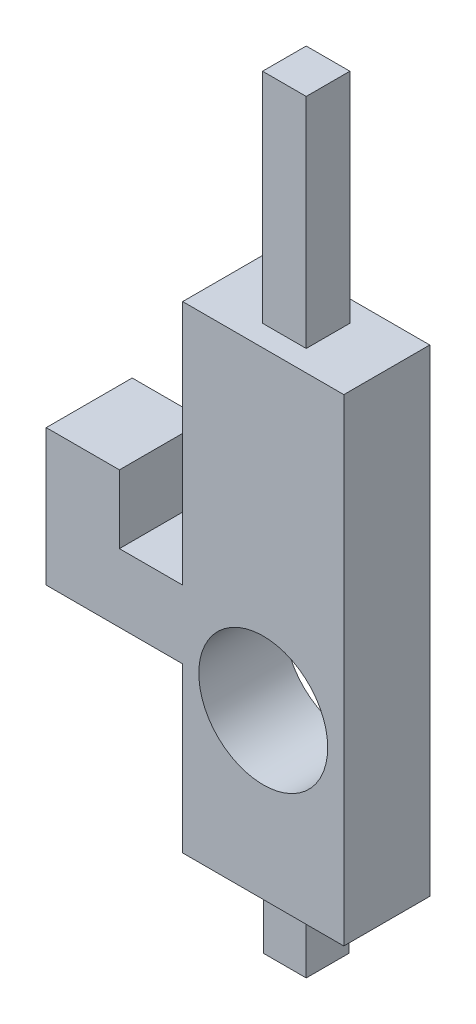
ISO-10303-21;
HEADER;
FILE_DESCRIPTION(('STEP AP214'),'2;1');
FILE_NAME('part.step','',(''),(''),'','','');
FILE_SCHEMA(('AUTOMOTIVE_DESIGN { 1 0 10303 214 1 1 1 1 }'));
ENDSEC;
DATA;
#1=APPLICATION_CONTEXT('core data for automotive mechanical design processes');
#2=APPLICATION_PROTOCOL_DEFINITION('international standard','automotive_design',2000,#1);
#3=PRODUCT_CONTEXT('',#1,'mechanical');
#4=PRODUCT('Part','Part','',(#3));
#5=PRODUCT_RELATED_PRODUCT_CATEGORY('part','',(#4));
#6=PRODUCT_DEFINITION_FORMATION('','',#4);
#7=PRODUCT_DEFINITION_CONTEXT('part definition',#1,'design');
#8=PRODUCT_DEFINITION('design','',#6,#7);
#9=PRODUCT_DEFINITION_SHAPE('','',#8);
#10=(LENGTH_UNIT() NAMED_UNIT(*) SI_UNIT(.MILLI.,.METRE.));
#11=(NAMED_UNIT(*) PLANE_ANGLE_UNIT() SI_UNIT($,.RADIAN.));
#12=(NAMED_UNIT(*) SI_UNIT($,.STERADIAN.) SOLID_ANGLE_UNIT());
#13=UNCERTAINTY_MEASURE_WITH_UNIT(LENGTH_MEASURE(1.E-05),#10,'distance_accuracy_value','');
#14=(GEOMETRIC_REPRESENTATION_CONTEXT(3) GLOBAL_UNCERTAINTY_ASSIGNED_CONTEXT((#13)) GLOBAL_UNIT_ASSIGNED_CONTEXT((#10,
#11,#12)) REPRESENTATION_CONTEXT('',''));
#15=CARTESIAN_POINT('',(0.,0.,0.));
#16=DIRECTION('',(0.,0.,1.));
#17=DIRECTION('',(1.,0.,0.));
#18=AXIS2_PLACEMENT_3D('',#15,#16,#17);
#19=CARTESIAN_POINT('',(-20.2,27.94,-3.99999999999999));
#20=DIRECTION('',(0.,-1.,0.));
#21=DIRECTION('',(0.,0.,-1.));
#22=AXIS2_PLACEMENT_3D('',#19,#20,#21);
#23=PLANE('',#22);
#24=DIRECTION('',(0.,0.,-1.));
#25=VECTOR('',#24,1.);
#26=CARTESIAN_POINT('',(-13.3876706043336,27.94,3.99999999999999));
#27=LINE('',#26,#25);
#28=CARTESIAN_POINT('',(-13.3876706043336,27.94,3.99999999999999));
#29=VERTEX_POINT('',#28);
#30=CARTESIAN_POINT('',(-13.3876706043336,27.94,-3.99999999999999));
#31=VERTEX_POINT('',#30);
#32=EDGE_CURVE('E181',#29,#31,#27,.T.);
#33=ORIENTED_EDGE('',*,*,#32,.F.);
#34=DIRECTION('',(1.,0.,0.));
#35=VECTOR('',#34,1.);
#36=CARTESIAN_POINT('',(-20.2,27.94,4.));
#37=LINE('',#36,#35);
#38=CARTESIAN_POINT('',(-7.5,27.94,4.));
#39=VERTEX_POINT('',#38);
#40=EDGE_CURVE('E204',#29,#39,#37,.T.);
#41=ORIENTED_EDGE('',*,*,#40,.T.);
#42=DIRECTION('',(0.,0.,-1.));
#43=VECTOR('',#42,1.);
#44=CARTESIAN_POINT('',(-7.5,27.94,-4.));
#45=LINE('',#44,#43);
#46=CARTESIAN_POINT('',(-7.5,27.94,-4.));
#47=VERTEX_POINT('',#46);
#48=EDGE_CURVE('E190',#39,#47,#45,.T.);
#49=ORIENTED_EDGE('',*,*,#48,.T.);
#50=DIRECTION('',(1.,0.,0.));
#51=VECTOR('',#50,1.);
#52=CARTESIAN_POINT('',(-20.2,27.94,-3.99999999999999));
#53=LINE('',#52,#51);
#54=EDGE_CURVE('E202',#31,#47,#53,.T.);
#55=ORIENTED_EDGE('',*,*,#54,.F.);
#56=EDGE_LOOP('',(#33,#41,#49,#55));
#57=FACE_BOUND('',#56,.T.);
#58=ADVANCED_FACE('F33',(#57),#23,.F.);
#59=CARTESIAN_POINT('',(-7.5,50.8,-4.));
#60=DIRECTION('',(1.,0.,0.));
#61=DIRECTION('',(0.,0.,-1.));
#62=AXIS2_PLACEMENT_3D('',#59,#60,#61);
#63=PLANE('',#62);
#64=DIRECTION('',(0.,0.,1.));
#65=VECTOR('',#64,1.);
#66=CARTESIAN_POINT('',(-7.5,21.59,-4.));
#67=LINE('',#66,#65);
#68=CARTESIAN_POINT('',(-7.5,21.59,-4.));
#69=VERTEX_POINT('',#68);
#70=CARTESIAN_POINT('',(-7.5,21.59,4.));
#71=VERTEX_POINT('',#70);
#72=EDGE_CURVE('E48',#69,#71,#67,.T.);
#73=ORIENTED_EDGE('',*,*,#72,.F.);
#74=DIRECTION('',(0.,-1.,0.));
#75=VECTOR('',#74,1.);
#76=CARTESIAN_POINT('',(-7.5,50.8,-4.));
#77=LINE('',#76,#75);
#78=CARTESIAN_POINT('',(-7.5,6.35,-4.));
#79=VERTEX_POINT('',#78);
#80=EDGE_CURVE('E270',#69,#79,#77,.T.);
#81=ORIENTED_EDGE('',*,*,#80,.T.);
#82=DIRECTION('',(0.,0.,1.));
#83=VECTOR('',#82,1.);
#84=CARTESIAN_POINT('',(-7.5,6.35,-4.));
#85=LINE('',#84,#83);
#86=CARTESIAN_POINT('',(-7.5,6.35,4.));
#87=VERTEX_POINT('',#86);
#88=EDGE_CURVE('E262',#79,#87,#85,.T.);
#89=ORIENTED_EDGE('',*,*,#88,.T.);
#90=DIRECTION('',(0.,-1.,0.));
#91=VECTOR('',#90,1.);
#92=CARTESIAN_POINT('',(-7.5,50.8,4.));
#93=LINE('',#92,#91);
#94=EDGE_CURVE('E53',#71,#87,#93,.T.);
#95=ORIENTED_EDGE('',*,*,#94,.F.);
#96=EDGE_LOOP('',(#73,#81,#89,#95));
#97=FACE_BOUND('',#96,.T.);
#98=ADVANCED_FACE('F330',(#97),#63,.F.);
#99=ORIENTED_EDGE('',*,*,#48,.F.);
#100=CARTESIAN_POINT('',(-7.5,50.8,4.));
#101=VERTEX_POINT('',#100);
#102=EDGE_CURVE('E267',#101,#39,#93,.T.);
#103=ORIENTED_EDGE('',*,*,#102,.F.);
#104=DIRECTION('',(0.,0.,1.));
#105=VECTOR('',#104,1.);
#106=CARTESIAN_POINT('',(-7.5,50.8,-4.));
#107=LINE('',#106,#105);
#108=CARTESIAN_POINT('',(-7.5,50.8,-4.));
#109=VERTEX_POINT('',#108);
#110=EDGE_CURVE('E252',#109,#101,#107,.T.);
#111=ORIENTED_EDGE('',*,*,#110,.F.);
#112=EDGE_CURVE('E271',#109,#47,#77,.T.);
#113=ORIENTED_EDGE('',*,*,#112,.T.);
#114=EDGE_LOOP('',(#99,#103,#111,#113));
#115=FACE_BOUND('',#114,.T.);
#116=ADVANCED_FACE('F328',(#115),#63,.F.);
#117=CARTESIAN_POINT('',(1.97989898732233,6.35,-1.97989898732233));
#118=DIRECTION('',(-1.,0.,0.));
#119=DIRECTION('',(0.,0.,1.));
#120=AXIS2_PLACEMENT_3D('',#117,#118,#119);
#121=PLANE('',#120);
#122=DIRECTION('',(0.,0.,-1.));
#123=VECTOR('',#122,1.);
#124=CARTESIAN_POINT('',(1.97989898732233,0.,-1.97989898732233));
#125=LINE('',#124,#123);
#126=CARTESIAN_POINT('',(1.97989898732233,0.,1.97989898732233));
#127=VERTEX_POINT('',#126);
#128=CARTESIAN_POINT('',(1.97989898732233,0.,-1.97989898732233));
#129=VERTEX_POINT('',#128);
#130=EDGE_CURVE('E277',#127,#129,#125,.T.);
#131=ORIENTED_EDGE('',*,*,#130,.T.);
#132=DIRECTION('',(0.,-1.,0.));
#133=VECTOR('',#132,1.);
#134=CARTESIAN_POINT('',(1.97989898732233,6.35,-1.97989898732233));
#135=LINE('',#134,#133);
#136=CARTESIAN_POINT('',(1.97989898732233,6.35,-1.97989898732233));
#137=VERTEX_POINT('',#136);
#138=EDGE_CURVE('E11',#137,#129,#135,.T.);
#139=ORIENTED_EDGE('',*,*,#138,.F.);
#140=DIRECTION('',(0.,0.,-1.));
#141=VECTOR('',#140,1.);
#142=CARTESIAN_POINT('',(1.97989898732233,6.35,-1.97989898732233));
#143=LINE('',#142,#141);
#144=CARTESIAN_POINT('',(1.97989898732233,6.35,1.97989898732233));
#145=VERTEX_POINT('',#144);
#146=EDGE_CURVE('E278',#145,#137,#143,.T.);
#147=ORIENTED_EDGE('',*,*,#146,.F.);
#148=DIRECTION('',(0.,-1.,0.));
#149=VECTOR('',#148,1.);
#150=CARTESIAN_POINT('',(1.97989898732233,6.35,1.97989898732233));
#151=LINE('',#150,#149);
#152=EDGE_CURVE('E291',#145,#127,#151,.T.);
#153=ORIENTED_EDGE('',*,*,#152,.T.);
#154=EDGE_LOOP('',(#131,#139,#147,#153));
#155=FACE_BOUND('',#154,.T.);
#156=ADVANCED_FACE('F35',(#155),#121,.F.);
#157=CARTESIAN_POINT('',(-1.97989898732233,6.35,-1.97989898732233));
#158=DIRECTION('',(0.,0.,1.));
#159=DIRECTION('',(1.,0.,0.));
#160=AXIS2_PLACEMENT_3D('',#157,#158,#159);
#161=PLANE('',#160);
#162=DIRECTION('',(-1.,0.,0.));
#163=VECTOR('',#162,1.);
#164=CARTESIAN_POINT('',(-1.97989898732233,0.,-1.97989898732233));
#165=LINE('',#164,#163);
#166=CARTESIAN_POINT('',(-1.97989898732233,0.,-1.97989898732233));
#167=VERTEX_POINT('',#166);
#168=EDGE_CURVE('E294',#129,#167,#165,.T.);
#169=ORIENTED_EDGE('',*,*,#168,.T.);
#170=DIRECTION('',(0.,-1.,0.));
#171=VECTOR('',#170,1.);
#172=CARTESIAN_POINT('',(-1.97989898732233,6.35,-1.97989898732233));
#173=LINE('',#172,#171);
#174=CARTESIAN_POINT('',(-1.97989898732233,6.35,-1.97989898732233));
#175=VERTEX_POINT('',#174);
#176=EDGE_CURVE('E41',#175,#167,#173,.T.);
#177=ORIENTED_EDGE('',*,*,#176,.F.);
#178=DIRECTION('',(-1.,0.,0.));
#179=VECTOR('',#178,1.);
#180=CARTESIAN_POINT('',(-1.97989898732233,6.35,-1.97989898732233));
#181=LINE('',#180,#179);
#182=EDGE_CURVE('E281',#137,#175,#181,.T.);
#183=ORIENTED_EDGE('',*,*,#182,.F.);
#184=ORIENTED_EDGE('',*,*,#138,.T.);
#185=EDGE_LOOP('',(#169,#177,#183,#184));
#186=FACE_BOUND('',#185,.T.);
#187=ADVANCED_FACE('F321',(#186),#161,.F.);
#188=CARTESIAN_POINT('',(-1.97989898732233,6.35,-1.97989898732233));
#189=DIRECTION('',(1.,0.,0.));
#190=DIRECTION('',(0.,0.,-1.));
#191=AXIS2_PLACEMENT_3D('',#188,#189,#190);
#192=PLANE('',#191);
#193=DIRECTION('',(0.,0.,1.));
#194=VECTOR('',#193,1.);
#195=CARTESIAN_POINT('',(-1.97989898732233,0.,-1.97989898732233));
#196=LINE('',#195,#194);
#197=CARTESIAN_POINT('',(-1.97989898732233,0.,1.97989898732233));
#198=VERTEX_POINT('',#197);
#199=EDGE_CURVE('E296',#167,#198,#196,.T.);
#200=ORIENTED_EDGE('',*,*,#199,.T.);
#201=DIRECTION('',(0.,-1.,0.));
#202=VECTOR('',#201,1.);
#203=CARTESIAN_POINT('',(-1.97989898732233,6.35,1.97989898732233));
#204=LINE('',#203,#202);
#205=CARTESIAN_POINT('',(-1.97989898732233,6.35,1.97989898732233));
#206=VERTEX_POINT('',#205);
#207=EDGE_CURVE('E301',#206,#198,#204,.T.);
#208=ORIENTED_EDGE('',*,*,#207,.F.);
#209=DIRECTION('',(0.,0.,1.));
#210=VECTOR('',#209,1.);
#211=CARTESIAN_POINT('',(-1.97989898732233,6.35,-1.97989898732233));
#212=LINE('',#211,#210);
#213=EDGE_CURVE('E285',#175,#206,#212,.T.);
#214=ORIENTED_EDGE('',*,*,#213,.F.);
#215=ORIENTED_EDGE('',*,*,#176,.T.);
#216=EDGE_LOOP('',(#200,#208,#214,#215));
#217=FACE_BOUND('',#216,.T.);
#218=ADVANCED_FACE('F307',(#217),#192,.F.);
#219=CARTESIAN_POINT('',(-1.97989898732233,6.35,1.97989898732233));
#220=DIRECTION('',(0.,0.,-1.));
#221=DIRECTION('',(-1.,0.,0.));
#222=AXIS2_PLACEMENT_3D('',#219,#220,#221);
#223=PLANE('',#222);
#224=DIRECTION('',(1.,0.,0.));
#225=VECTOR('',#224,1.);
#226=CARTESIAN_POINT('',(-1.97989898732233,0.,1.97989898732233));
#227=LINE('',#226,#225);
#228=EDGE_CURVE('E282',#198,#127,#227,.T.);
#229=ORIENTED_EDGE('',*,*,#228,.T.);
#230=ORIENTED_EDGE('',*,*,#152,.F.);
#231=DIRECTION('',(1.,0.,0.));
#232=VECTOR('',#231,1.);
#233=CARTESIAN_POINT('',(-1.97989898732233,6.35,1.97989898732233));
#234=LINE('',#233,#232);
#235=EDGE_CURVE('E288',#206,#145,#234,.T.);
#236=ORIENTED_EDGE('',*,*,#235,.F.);
#237=ORIENTED_EDGE('',*,*,#207,.T.);
#238=EDGE_LOOP('',(#229,#230,#236,#237));
#239=FACE_BOUND('',#238,.T.);
#240=ADVANCED_FACE('F315',(#239),#223,.F.);
#241=CARTESIAN_POINT('',(0.,0.,0.));
#242=DIRECTION('',(0.,1.,0.));
#243=DIRECTION('',(0.,0.,1.));
#244=AXIS2_PLACEMENT_3D('',#241,#242,#243);
#245=PLANE('',#244);
#246=ORIENTED_EDGE('',*,*,#130,.F.);
#247=ORIENTED_EDGE('',*,*,#228,.F.);
#248=ORIENTED_EDGE('',*,*,#199,.F.);
#249=ORIENTED_EDGE('',*,*,#168,.F.);
#250=EDGE_LOOP('',(#246,#247,#248,#249));
#251=FACE_BOUND('',#250,.T.);
#252=ADVANCED_FACE('F312',(#251),#245,.F.);
#253=CARTESIAN_POINT('',(0.,6.35,0.));
#254=DIRECTION('',(0.,1.,0.));
#255=DIRECTION('',(0.,0.,1.));
#256=AXIS2_PLACEMENT_3D('',#253,#254,#255);
#257=PLANE('',#256);
#258=DIRECTION('',(0.,0.,-1.));
#259=VECTOR('',#258,1.);
#260=CARTESIAN_POINT('',(7.5,6.35,-4.));
#261=LINE('',#260,#259);
#262=CARTESIAN_POINT('',(7.5,6.35,4.));
#263=VERTEX_POINT('',#262);
#264=CARTESIAN_POINT('',(7.5,6.35,-4.));
#265=VERTEX_POINT('',#264);
#266=EDGE_CURVE('E245',#263,#265,#261,.T.);
#267=ORIENTED_EDGE('',*,*,#266,.F.);
#268=DIRECTION('',(1.,0.,0.));
#269=VECTOR('',#268,1.);
#270=CARTESIAN_POINT('',(-7.5,6.35,4.));
#271=LINE('',#270,#269);
#272=EDGE_CURVE('E250',#87,#263,#271,.T.);
#273=ORIENTED_EDGE('',*,*,#272,.F.);
#274=ORIENTED_EDGE('',*,*,#88,.F.);
#275=DIRECTION('',(-1.,0.,0.));
#276=VECTOR('',#275,1.);
#277=CARTESIAN_POINT('',(-7.5,6.35,-4.));
#278=LINE('',#277,#276);
#279=EDGE_CURVE('E259',#265,#79,#278,.T.);
#280=ORIENTED_EDGE('',*,*,#279,.F.);
#281=EDGE_LOOP('',(#267,#273,#274,#280));
#282=FACE_BOUND('',#281,.T.);
#283=ORIENTED_EDGE('',*,*,#235,.T.);
#284=ORIENTED_EDGE('',*,*,#146,.T.);
#285=ORIENTED_EDGE('',*,*,#182,.T.);
#286=ORIENTED_EDGE('',*,*,#213,.T.);
#287=EDGE_LOOP('',(#283,#284,#285,#286));
#288=FACE_BOUND('',#287,.T.);
#289=ADVANCED_FACE('F320',(#282,#288),#257,.F.);
#290=CARTESIAN_POINT('',(7.5,50.8,-4.));
#291=DIRECTION('',(-1.,0.,0.));
#292=DIRECTION('',(0.,0.,1.));
#293=AXIS2_PLACEMENT_3D('',#290,#291,#292);
#294=PLANE('',#293);
#295=ORIENTED_EDGE('',*,*,#266,.T.);
#296=DIRECTION('',(0.,-1.,0.));
#297=VECTOR('',#296,1.);
#298=CARTESIAN_POINT('',(7.5,50.8,-4.));
#299=LINE('',#298,#297);
#300=CARTESIAN_POINT('',(7.5,50.8,-4.));
#301=VERTEX_POINT('',#300);
#302=EDGE_CURVE('E274',#301,#265,#299,.T.);
#303=ORIENTED_EDGE('',*,*,#302,.F.);
#304=DIRECTION('',(0.,0.,-1.));
#305=VECTOR('',#304,1.);
#306=CARTESIAN_POINT('',(7.5,50.8,-4.));
#307=LINE('',#306,#305);
#308=CARTESIAN_POINT('',(7.5,50.8,4.));
#309=VERTEX_POINT('',#308);
#310=EDGE_CURVE('E246',#309,#301,#307,.T.);
#311=ORIENTED_EDGE('',*,*,#310,.F.);
#312=DIRECTION('',(0.,-1.,0.));
#313=VECTOR('',#312,1.);
#314=CARTESIAN_POINT('',(7.5,50.8,4.));
#315=LINE('',#314,#313);
#316=EDGE_CURVE('E256',#309,#263,#315,.T.);
#317=ORIENTED_EDGE('',*,*,#316,.T.);
#318=EDGE_LOOP('',(#295,#303,#311,#317));
#319=FACE_BOUND('',#318,.T.);
#320=ADVANCED_FACE('F374',(#319),#294,.F.);
#321=CARTESIAN_POINT('',(-7.5,50.8,-4.));
#322=DIRECTION('',(0.,0.,1.));
#323=DIRECTION('',(1.,0.,0.));
#324=AXIS2_PLACEMENT_3D('',#321,#322,#323);
#325=PLANE('',#324);
#326=CARTESIAN_POINT('',(0.,21.59,-4.));
#327=DIRECTION('',(0.,0.,1.));
#328=DIRECTION('',(1.,0.,0.));
#329=AXIS2_PLACEMENT_3D('',#326,#327,#328);
#330=CIRCLE('',#329,6.);
#331=CARTESIAN_POINT('',(6.,21.59,-4.));
#332=VERTEX_POINT('',#331);
#333=EDGE_CURVE('E242',#332,#332,#330,.T.);
#334=ORIENTED_EDGE('',*,*,#333,.T.);
#335=EDGE_LOOP('',(#334));
#336=FACE_BOUND('',#335,.T.);
#337=ORIENTED_EDGE('',*,*,#279,.T.);
#338=ORIENTED_EDGE('',*,*,#80,.F.);
#339=DIRECTION('',(1.,0.,0.));
#340=VECTOR('',#339,1.);
#341=CARTESIAN_POINT('',(-20.2,21.59,-3.99999999999999));
#342=LINE('',#341,#340);
#343=CARTESIAN_POINT('',(-20.2,21.59,-3.99999999999999));
#344=VERTEX_POINT('',#343);
#345=EDGE_CURVE('E199',#344,#69,#342,.T.);
#346=ORIENTED_EDGE('',*,*,#345,.F.);
#347=DIRECTION('',(0.,-1.,0.));
#348=VECTOR('',#347,1.);
#349=CARTESIAN_POINT('',(-20.2,21.59,-3.99999999999999));
#350=LINE('',#349,#348);
#351=CARTESIAN_POINT('',(-20.2,34.29,-3.99999999999999));
#352=VERTEX_POINT('',#351);
#353=EDGE_CURVE('E166',#352,#344,#350,.T.);
#354=ORIENTED_EDGE('',*,*,#353,.F.);
#355=DIRECTION('',(-1.,0.,0.));
#356=VECTOR('',#355,1.);
#357=CARTESIAN_POINT('',(-13.3876706043336,34.29,-3.99999999999999));
#358=LINE('',#357,#356);
#359=CARTESIAN_POINT('',(-13.3876706043336,34.29,-3.99999999999999));
#360=VERTEX_POINT('',#359);
#361=EDGE_CURVE('E180',#360,#352,#358,.T.);
#362=ORIENTED_EDGE('',*,*,#361,.F.);
#363=DIRECTION('',(0.,-1.,0.));
#364=VECTOR('',#363,1.);
#365=CARTESIAN_POINT('',(-13.3876706043336,34.29,-3.99999999999999));
#366=LINE('',#365,#364);
#367=EDGE_CURVE('E186',#360,#31,#366,.T.);
#368=ORIENTED_EDGE('',*,*,#367,.T.);
#369=ORIENTED_EDGE('',*,*,#54,.T.);
#370=ORIENTED_EDGE('',*,*,#112,.F.);
#371=DIRECTION('',(-1.,0.,0.));
#372=VECTOR('',#371,1.);
#373=CARTESIAN_POINT('',(-7.5,50.8,-4.));
#374=LINE('',#373,#372);
#375=EDGE_CURVE('E249',#301,#109,#374,.T.);
#376=ORIENTED_EDGE('',*,*,#375,.F.);
#377=ORIENTED_EDGE('',*,*,#302,.T.);
#378=EDGE_LOOP('',(#337,#338,#346,#354,#362,#368,#369,#370,#376,#377));
#379=FACE_BOUND('',#378,.T.);
#380=ADVANCED_FACE('F377',(#336,#379),#325,.F.);
#381=CARTESIAN_POINT('',(-7.5,50.8,4.));
#382=DIRECTION('',(0.,0.,-1.));
#383=DIRECTION('',(-1.,0.,0.));
#384=AXIS2_PLACEMENT_3D('',#381,#382,#383);
#385=PLANE('',#384);
#386=CARTESIAN_POINT('',(0.,21.59,4.));
#387=DIRECTION('',(0.,0.,1.));
#388=DIRECTION('',(1.,0.,0.));
#389=AXIS2_PLACEMENT_3D('',#386,#387,#388);
#390=CIRCLE('',#389,6.);
#391=CARTESIAN_POINT('',(6.,21.59,4.));
#392=VERTEX_POINT('',#391);
#393=EDGE_CURVE('E239',#392,#392,#390,.T.);
#394=ORIENTED_EDGE('',*,*,#393,.F.);
#395=EDGE_LOOP('',(#394));
#396=FACE_BOUND('',#395,.T.);
#397=ORIENTED_EDGE('',*,*,#272,.T.);
#398=ORIENTED_EDGE('',*,*,#316,.F.);
#399=DIRECTION('',(1.,0.,0.));
#400=VECTOR('',#399,1.);
#401=CARTESIAN_POINT('',(-7.5,50.8,4.));
#402=LINE('',#401,#400);
#403=EDGE_CURVE('E254',#101,#309,#402,.T.);
#404=ORIENTED_EDGE('',*,*,#403,.F.);
#405=ORIENTED_EDGE('',*,*,#102,.T.);
#406=ORIENTED_EDGE('',*,*,#40,.F.);
#407=DIRECTION('',(0.,-1.,0.));
#408=VECTOR('',#407,1.);
#409=CARTESIAN_POINT('',(-13.3876706043336,34.29,3.99999999999999));
#410=LINE('',#409,#408);
#411=CARTESIAN_POINT('',(-13.3876706043336,34.29,3.99999999999999));
#412=VERTEX_POINT('',#411);
#413=EDGE_CURVE('E172',#412,#29,#410,.T.);
#414=ORIENTED_EDGE('',*,*,#413,.F.);
#415=DIRECTION('',(1.,0.,0.));
#416=VECTOR('',#415,1.);
#417=CARTESIAN_POINT('',(-13.3876706043336,34.29,3.99999999999999));
#418=LINE('',#417,#416);
#419=CARTESIAN_POINT('',(-20.2,34.29,3.99999999999999));
#420=VERTEX_POINT('',#419);
#421=EDGE_CURVE('E169',#420,#412,#418,.T.);
#422=ORIENTED_EDGE('',*,*,#421,.F.);
#423=DIRECTION('',(0.,1.,0.));
#424=VECTOR('',#423,1.);
#425=CARTESIAN_POINT('',(-20.2,21.59,4.));
#426=LINE('',#425,#424);
#427=CARTESIAN_POINT('',(-20.2,21.59,4.));
#428=VERTEX_POINT('',#427);
#429=EDGE_CURVE('E156',#428,#420,#426,.T.);
#430=ORIENTED_EDGE('',*,*,#429,.F.);
#431=DIRECTION('',(1.,0.,0.));
#432=VECTOR('',#431,1.);
#433=CARTESIAN_POINT('',(-20.2,21.59,4.));
#434=LINE('',#433,#432);
#435=EDGE_CURVE('E194',#428,#71,#434,.T.);
#436=ORIENTED_EDGE('',*,*,#435,.T.);
#437=ORIENTED_EDGE('',*,*,#94,.T.);
#438=EDGE_LOOP('',(#397,#398,#404,#405,#406,#414,#422,#430,#436,#437));
#439=FACE_BOUND('',#438,.T.);
#440=ADVANCED_FACE('F170',(#396,#439),#385,.F.);
#441=CARTESIAN_POINT('',(0.,50.8,0.));
#442=DIRECTION('',(0.,1.,0.));
#443=DIRECTION('',(0.,0.,1.));
#444=AXIS2_PLACEMENT_3D('',#441,#442,#443);
#445=PLANE('',#444);
#446=DIRECTION('',(0.,0.,-1.));
#447=VECTOR('',#446,1.);
#448=CARTESIAN_POINT('',(2.032,50.8,-2.032));
#449=LINE('',#448,#447);
#450=CARTESIAN_POINT('',(2.032,50.8,2.032));
#451=VERTEX_POINT('',#450);
#452=CARTESIAN_POINT('',(2.032,50.8,-2.032));
#453=VERTEX_POINT('',#452);
#454=EDGE_CURVE('E206',#451,#453,#449,.T.);
#455=ORIENTED_EDGE('',*,*,#454,.F.);
#456=DIRECTION('',(1.,0.,0.));
#457=VECTOR('',#456,1.);
#458=CARTESIAN_POINT('',(-2.032,50.8,2.032));
#459=LINE('',#458,#457);
#460=CARTESIAN_POINT('',(-2.032,50.8,2.032));
#461=VERTEX_POINT('',#460);
#462=EDGE_CURVE('E211',#461,#451,#459,.T.);
#463=ORIENTED_EDGE('',*,*,#462,.F.);
#464=DIRECTION('',(0.,0.,1.));
#465=VECTOR('',#464,1.);
#466=CARTESIAN_POINT('',(-2.032,50.8,-2.032));
#467=LINE('',#466,#465);
#468=CARTESIAN_POINT('',(-2.032,50.8,-2.032));
#469=VERTEX_POINT('',#468);
#470=EDGE_CURVE('E223',#469,#461,#467,.T.);
#471=ORIENTED_EDGE('',*,*,#470,.F.);
#472=DIRECTION('',(-1.,0.,0.));
#473=VECTOR('',#472,1.);
#474=CARTESIAN_POINT('',(-2.032,50.8,-2.032));
#475=LINE('',#474,#473);
#476=EDGE_CURVE('E220',#453,#469,#475,.T.);
#477=ORIENTED_EDGE('',*,*,#476,.F.);
#478=EDGE_LOOP('',(#455,#463,#471,#477));
#479=FACE_BOUND('',#478,.T.);
#480=ORIENTED_EDGE('',*,*,#310,.T.);
#481=ORIENTED_EDGE('',*,*,#375,.T.);
#482=ORIENTED_EDGE('',*,*,#110,.T.);
#483=ORIENTED_EDGE('',*,*,#403,.T.);
#484=EDGE_LOOP('',(#480,#481,#482,#483));
#485=FACE_BOUND('',#484,.T.);
#486=ADVANCED_FACE('F367',(#479,#485),#445,.T.);
#487=CARTESIAN_POINT('',(0.,21.59,-21.4));
#488=DIRECTION('',(0.,0.,1.));
#489=DIRECTION('',(1.,0.,0.));
#490=AXIS2_PLACEMENT_3D('',#487,#488,#489);
#491=CYLINDRICAL_SURFACE('',#490,6.);
#492=ORIENTED_EDGE('',*,*,#393,.T.);
#493=EDGE_LOOP('',(#492));
#494=FACE_BOUND('',#493,.T.);
#495=ORIENTED_EDGE('',*,*,#333,.F.);
#496=EDGE_LOOP('',(#495));
#497=FACE_BOUND('',#496,.T.);
#498=ADVANCED_FACE('F363',(#494,#497),#491,.F.);
#499=CARTESIAN_POINT('',(2.032,71.12,-2.032));
#500=DIRECTION('',(-1.,0.,0.));
#501=DIRECTION('',(0.,0.,1.));
#502=AXIS2_PLACEMENT_3D('',#499,#500,#501);
#503=PLANE('',#502);
#504=ORIENTED_EDGE('',*,*,#454,.T.);
#505=DIRECTION('',(0.,-1.,0.));
#506=VECTOR('',#505,1.);
#507=CARTESIAN_POINT('',(2.032,71.12,-2.032));
#508=LINE('',#507,#506);
#509=CARTESIAN_POINT('',(2.032,71.12,-2.032));
#510=VERTEX_POINT('',#509);
#511=EDGE_CURVE('E236',#510,#453,#508,.T.);
#512=ORIENTED_EDGE('',*,*,#511,.F.);
#513=DIRECTION('',(0.,0.,-1.));
#514=VECTOR('',#513,1.);
#515=CARTESIAN_POINT('',(2.032,71.12,-2.032));
#516=LINE('',#515,#514);
#517=CARTESIAN_POINT('',(2.032,71.12,2.032));
#518=VERTEX_POINT('',#517);
#519=EDGE_CURVE('E207',#518,#510,#516,.T.);
#520=ORIENTED_EDGE('',*,*,#519,.F.);
#521=DIRECTION('',(0.,-1.,0.));
#522=VECTOR('',#521,1.);
#523=CARTESIAN_POINT('',(2.032,71.12,2.032));
#524=LINE('',#523,#522);
#525=EDGE_CURVE('E217',#518,#451,#524,.T.);
#526=ORIENTED_EDGE('',*,*,#525,.T.);
#527=EDGE_LOOP('',(#504,#512,#520,#526));
#528=FACE_BOUND('',#527,.T.);
#529=ADVANCED_FACE('F359',(#528),#503,.F.);
#530=CARTESIAN_POINT('',(-2.032,71.12,-2.032));
#531=DIRECTION('',(0.,0.,1.));
#532=DIRECTION('',(1.,0.,0.));
#533=AXIS2_PLACEMENT_3D('',#530,#531,#532);
#534=PLANE('',#533);
#535=ORIENTED_EDGE('',*,*,#476,.T.);
#536=DIRECTION('',(0.,-1.,0.));
#537=VECTOR('',#536,1.);
#538=CARTESIAN_POINT('',(-2.032,71.12,-2.032));
#539=LINE('',#538,#537);
#540=CARTESIAN_POINT('',(-2.032,71.12,-2.032));
#541=VERTEX_POINT('',#540);
#542=EDGE_CURVE('E233',#541,#469,#539,.T.);
#543=ORIENTED_EDGE('',*,*,#542,.F.);
#544=DIRECTION('',(-1.,0.,0.));
#545=VECTOR('',#544,1.);
#546=CARTESIAN_POINT('',(-2.032,71.12,-2.032));
#547=LINE('',#546,#545);
#548=EDGE_CURVE('E210',#510,#541,#547,.T.);
#549=ORIENTED_EDGE('',*,*,#548,.F.);
#550=ORIENTED_EDGE('',*,*,#511,.T.);
#551=EDGE_LOOP('',(#535,#543,#549,#550));
#552=FACE_BOUND('',#551,.T.);
#553=ADVANCED_FACE('F355',(#552),#534,.F.);
#554=CARTESIAN_POINT('',(-2.032,71.12,-2.032));
#555=DIRECTION('',(1.,0.,0.));
#556=DIRECTION('',(0.,0.,-1.));
#557=AXIS2_PLACEMENT_3D('',#554,#555,#556);
#558=PLANE('',#557);
#559=ORIENTED_EDGE('',*,*,#470,.T.);
#560=DIRECTION('',(0.,-1.,0.));
#561=VECTOR('',#560,1.);
#562=CARTESIAN_POINT('',(-2.032,71.12,2.032));
#563=LINE('',#562,#561);
#564=CARTESIAN_POINT('',(-2.032,71.12,2.032));
#565=VERTEX_POINT('',#564);
#566=EDGE_CURVE('E230',#565,#461,#563,.T.);
#567=ORIENTED_EDGE('',*,*,#566,.F.);
#568=DIRECTION('',(0.,0.,1.));
#569=VECTOR('',#568,1.);
#570=CARTESIAN_POINT('',(-2.032,71.12,-2.032));
#571=LINE('',#570,#569);
#572=EDGE_CURVE('E213',#541,#565,#571,.T.);
#573=ORIENTED_EDGE('',*,*,#572,.F.);
#574=ORIENTED_EDGE('',*,*,#542,.T.);
#575=EDGE_LOOP('',(#559,#567,#573,#574));
#576=FACE_BOUND('',#575,.T.);
#577=ADVANCED_FACE('F351',(#576),#558,.F.);
#578=CARTESIAN_POINT('',(-2.032,71.12,2.032));
#579=DIRECTION('',(0.,0.,-1.));
#580=DIRECTION('',(-1.,0.,0.));
#581=AXIS2_PLACEMENT_3D('',#578,#579,#580);
#582=PLANE('',#581);
#583=ORIENTED_EDGE('',*,*,#462,.T.);
#584=ORIENTED_EDGE('',*,*,#525,.F.);
#585=DIRECTION('',(1.,0.,0.));
#586=VECTOR('',#585,1.);
#587=CARTESIAN_POINT('',(-2.032,71.12,2.032));
#588=LINE('',#587,#586);
#589=EDGE_CURVE('E215',#565,#518,#588,.T.);
#590=ORIENTED_EDGE('',*,*,#589,.F.);
#591=ORIENTED_EDGE('',*,*,#566,.T.);
#592=EDGE_LOOP('',(#583,#584,#590,#591));
#593=FACE_BOUND('',#592,.T.);
#594=ADVANCED_FACE('F347',(#593),#582,.F.);
#595=CARTESIAN_POINT('',(0.,71.12,0.));
#596=DIRECTION('',(0.,1.,0.));
#597=DIRECTION('',(0.,0.,1.));
#598=AXIS2_PLACEMENT_3D('',#595,#596,#597);
#599=PLANE('',#598);
#600=ORIENTED_EDGE('',*,*,#519,.T.);
#601=ORIENTED_EDGE('',*,*,#548,.T.);
#602=ORIENTED_EDGE('',*,*,#572,.T.);
#603=ORIENTED_EDGE('',*,*,#589,.T.);
#604=EDGE_LOOP('',(#600,#601,#602,#603));
#605=FACE_BOUND('',#604,.T.);
#606=ADVANCED_FACE('F344',(#605),#599,.T.);
#607=CARTESIAN_POINT('',(-20.2,21.59,-3.99999999999999));
#608=DIRECTION('',(0.,1.,0.));
#609=DIRECTION('',(0.,0.,1.));
#610=AXIS2_PLACEMENT_3D('',#607,#608,#609);
#611=PLANE('',#610);
#612=ORIENTED_EDGE('',*,*,#72,.T.);
#613=ORIENTED_EDGE('',*,*,#435,.F.);
#614=DIRECTION('',(0.,0.,1.));
#615=VECTOR('',#614,1.);
#616=CARTESIAN_POINT('',(-20.2,21.59,-3.99999999999999));
#617=LINE('',#616,#615);
#618=EDGE_CURVE('E162',#344,#428,#617,.T.);
#619=ORIENTED_EDGE('',*,*,#618,.F.);
#620=ORIENTED_EDGE('',*,*,#345,.T.);
#621=EDGE_LOOP('',(#612,#613,#619,#620));
#622=FACE_BOUND('',#621,.T.);
#623=ADVANCED_FACE('F342',(#622),#611,.F.);
#624=CARTESIAN_POINT('',(-20.2,0.,0.));
#625=DIRECTION('',(1.,0.,0.));
#626=DIRECTION('',(0.,0.,-1.));
#627=AXIS2_PLACEMENT_3D('',#624,#625,#626);
#628=PLANE('',#627);
#629=ORIENTED_EDGE('',*,*,#429,.T.);
#630=DIRECTION('',(0.,0.,1.));
#631=VECTOR('',#630,1.);
#632=CARTESIAN_POINT('',(-20.2,34.29,3.99999999999999));
#633=LINE('',#632,#631);
#634=EDGE_CURVE('E160',#352,#420,#633,.T.);
#635=ORIENTED_EDGE('',*,*,#634,.F.);
#636=ORIENTED_EDGE('',*,*,#353,.T.);
#637=ORIENTED_EDGE('',*,*,#618,.T.);
#638=EDGE_LOOP('',(#629,#635,#636,#637));
#639=FACE_BOUND('',#638,.T.);
#640=ADVANCED_FACE('F158',(#639),#628,.F.);
#641=CARTESIAN_POINT('',(-13.3876706043336,34.29,3.99999999999999));
#642=DIRECTION('',(-1.,0.,0.));
#643=DIRECTION('',(0.,0.,1.));
#644=AXIS2_PLACEMENT_3D('',#641,#642,#643);
#645=PLANE('',#644);
#646=ORIENTED_EDGE('',*,*,#32,.T.);
#647=ORIENTED_EDGE('',*,*,#367,.F.);
#648=DIRECTION('',(0.,0.,-1.));
#649=VECTOR('',#648,1.);
#650=CARTESIAN_POINT('',(-13.3876706043336,34.29,3.99999999999999));
#651=LINE('',#650,#649);
#652=EDGE_CURVE('E175',#412,#360,#651,.T.);
#653=ORIENTED_EDGE('',*,*,#652,.F.);
#654=ORIENTED_EDGE('',*,*,#413,.T.);
#655=EDGE_LOOP('',(#646,#647,#653,#654));
#656=FACE_BOUND('',#655,.T.);
#657=ADVANCED_FACE('F480',(#656),#645,.F.);
#658=CARTESIAN_POINT('',(0.,34.29,0.));
#659=DIRECTION('',(0.,1.,0.));
#660=DIRECTION('',(0.,0.,1.));
#661=AXIS2_PLACEMENT_3D('',#658,#659,#660);
#662=PLANE('',#661);
#663=ORIENTED_EDGE('',*,*,#634,.T.);
#664=ORIENTED_EDGE('',*,*,#421,.T.);
#665=ORIENTED_EDGE('',*,*,#652,.T.);
#666=ORIENTED_EDGE('',*,*,#361,.T.);
#667=EDGE_LOOP('',(#663,#664,#665,#666));
#668=FACE_BOUND('',#667,.T.);
#669=ADVANCED_FACE('F178',(#668),#662,.T.);
#670=CLOSED_SHELL('',(#58,#98,#116,#156,#187,#218,#240,#252,#289,#320,#380,#440,#486,#498,#529,
#553,#577,#594,#606,#623,#640,#657,#669));
#671=MANIFOLD_SOLID_BREP('B2',#670);
#672=ADVANCED_BREP_SHAPE_REPRESENTATION('',(#18,#671),#14);
#673=SHAPE_DEFINITION_REPRESENTATION(#9,#672);
ENDSEC;
END-ISO-10303-21;
